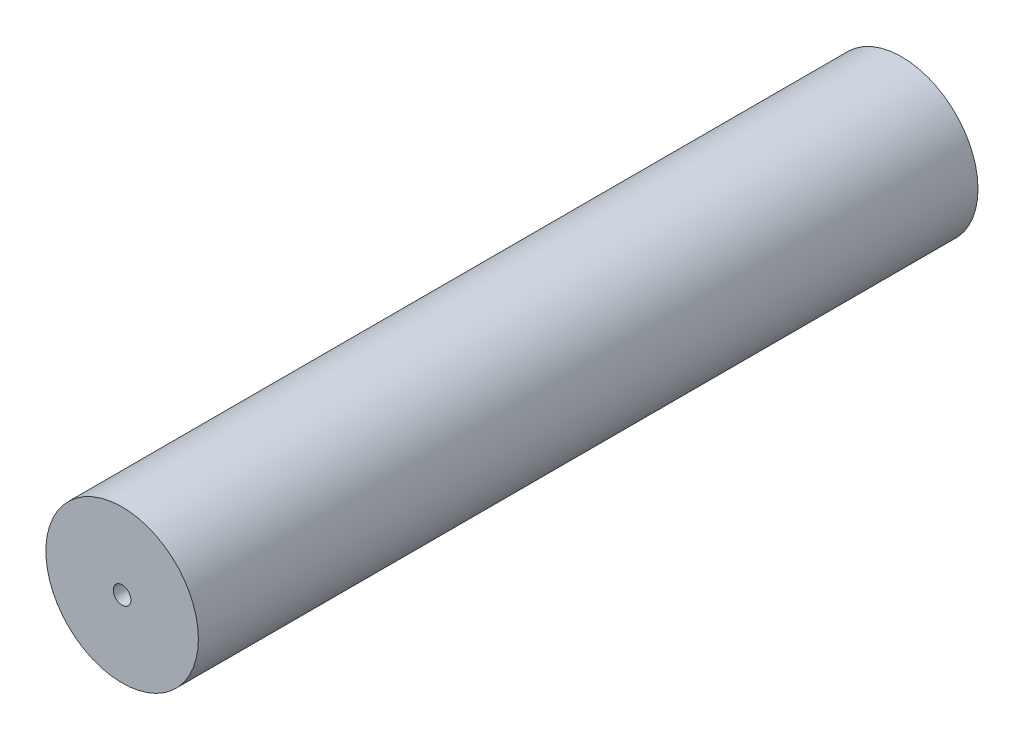
ISO-10303-21;
HEADER;
FILE_DESCRIPTION(('STEP AP214'),'2;1');
FILE_NAME('part.step','',(''),(''),'','','');
FILE_SCHEMA(('AUTOMOTIVE_DESIGN { 1 0 10303 214 1 1 1 1 }'));
ENDSEC;
DATA;
#1=APPLICATION_CONTEXT('core data for automotive mechanical design processes');
#2=APPLICATION_PROTOCOL_DEFINITION('international standard','automotive_design',2000,#1);
#3=PRODUCT_CONTEXT('',#1,'mechanical');
#4=PRODUCT('Part','Part','',(#3));
#5=PRODUCT_RELATED_PRODUCT_CATEGORY('part','',(#4));
#6=PRODUCT_DEFINITION_FORMATION('','',#4);
#7=PRODUCT_DEFINITION_CONTEXT('part definition',#1,'design');
#8=PRODUCT_DEFINITION('design','',#6,#7);
#9=PRODUCT_DEFINITION_SHAPE('','',#8);
#10=(LENGTH_UNIT() NAMED_UNIT(*) SI_UNIT(.MILLI.,.METRE.));
#11=(NAMED_UNIT(*) PLANE_ANGLE_UNIT() SI_UNIT($,.RADIAN.));
#12=(NAMED_UNIT(*) SI_UNIT($,.STERADIAN.) SOLID_ANGLE_UNIT());
#13=UNCERTAINTY_MEASURE_WITH_UNIT(LENGTH_MEASURE(1.E-05),#10,'distance_accuracy_value','');
#14=(GEOMETRIC_REPRESENTATION_CONTEXT(3) GLOBAL_UNCERTAINTY_ASSIGNED_CONTEXT((#13)) GLOBAL_UNIT_ASSIGNED_CONTEXT((#10,
#11,#12)) REPRESENTATION_CONTEXT('',''));
#15=CARTESIAN_POINT('',(0.,0.,0.));
#16=DIRECTION('',(0.,0.,1.));
#17=DIRECTION('',(1.,0.,0.));
#18=AXIS2_PLACEMENT_3D('',#15,#16,#17);
#19=CARTESIAN_POINT('',(0.,0.,292.1));
#20=DIRECTION('',(0.,0.,1.));
#21=DIRECTION('',(1.,0.,0.));
#22=AXIS2_PLACEMENT_3D('',#19,#20,#21);
#23=PLANE('',#22);
#24=CARTESIAN_POINT('',(0.,0.,292.1));
#25=DIRECTION('',(0.,0.,1.));
#26=DIRECTION('',(1.,0.,0.));
#27=AXIS2_PLACEMENT_3D('',#24,#25,#26);
#28=CIRCLE('',#27,28.575);
#29=CARTESIAN_POINT('',(28.575,0.,292.1));
#30=VERTEX_POINT('',#29);
#31=EDGE_CURVE('E10',#30,#30,#28,.T.);
#32=ORIENTED_EDGE('',*,*,#31,.T.);
#33=EDGE_LOOP('',(#32));
#34=FACE_BOUND('',#33,.T.);
#35=CARTESIAN_POINT('',(0.,0.,292.1));
#36=DIRECTION('',(0.,0.,1.));
#37=DIRECTION('',(1.,0.,0.));
#38=AXIS2_PLACEMENT_3D('',#35,#36,#37);
#39=CIRCLE('',#38,3.302);
#40=CARTESIAN_POINT('',(3.302,0.,292.1));
#41=VERTEX_POINT('',#40);
#42=EDGE_CURVE('E42',#41,#41,#39,.T.);
#43=ORIENTED_EDGE('',*,*,#42,.F.);
#44=EDGE_LOOP('',(#43));
#45=FACE_BOUND('',#44,.T.);
#46=ADVANCED_FACE('F31',(#34,#45),#23,.T.);
#47=CARTESIAN_POINT('',(0.,0.,0.));
#48=DIRECTION('',(0.,0.,1.));
#49=DIRECTION('',(1.,0.,0.));
#50=AXIS2_PLACEMENT_3D('',#47,#48,#49);
#51=PLANE('',#50);
#52=CARTESIAN_POINT('',(0.,0.,0.));
#53=DIRECTION('',(0.,0.,1.));
#54=DIRECTION('',(1.,0.,0.));
#55=AXIS2_PLACEMENT_3D('',#52,#53,#54);
#56=CIRCLE('',#55,28.575);
#57=CARTESIAN_POINT('',(28.575,0.,0.));
#58=VERTEX_POINT('',#57);
#59=EDGE_CURVE('E35',#58,#58,#56,.T.);
#60=ORIENTED_EDGE('',*,*,#59,.F.);
#61=EDGE_LOOP('',(#60));
#62=FACE_BOUND('',#61,.T.);
#63=CARTESIAN_POINT('',(0.,0.,0.));
#64=DIRECTION('',(0.,0.,1.));
#65=DIRECTION('',(1.,0.,0.));
#66=AXIS2_PLACEMENT_3D('',#63,#64,#65);
#67=CIRCLE('',#66,3.302);
#68=CARTESIAN_POINT('',(3.302,0.,0.));
#69=VERTEX_POINT('',#68);
#70=EDGE_CURVE('E44',#69,#69,#67,.T.);
#71=ORIENTED_EDGE('',*,*,#70,.T.);
#72=EDGE_LOOP('',(#71));
#73=FACE_BOUND('',#72,.T.);
#74=ADVANCED_FACE('F54',(#62,#73),#51,.F.);
#75=CARTESIAN_POINT('',(0.,0.,292.1));
#76=DIRECTION('',(0.,0.,-1.));
#77=DIRECTION('',(-1.,0.,0.));
#78=AXIS2_PLACEMENT_3D('',#75,#76,#77);
#79=CYLINDRICAL_SURFACE('',#78,28.575);
#80=ORIENTED_EDGE('',*,*,#31,.F.);
#81=EDGE_LOOP('',(#80));
#82=FACE_BOUND('',#81,.T.);
#83=ORIENTED_EDGE('',*,*,#59,.T.);
#84=EDGE_LOOP('',(#83));
#85=FACE_BOUND('',#84,.T.);
#86=ADVANCED_FACE('F33',(#82,#85),#79,.T.);
#87=CARTESIAN_POINT('',(0.,0.,292.1));
#88=DIRECTION('',(0.,0.,-1.));
#89=DIRECTION('',(-1.,0.,0.));
#90=AXIS2_PLACEMENT_3D('',#87,#88,#89);
#91=CYLINDRICAL_SURFACE('',#90,3.302);
#92=ORIENTED_EDGE('',*,*,#42,.T.);
#93=EDGE_LOOP('',(#92));
#94=FACE_BOUND('',#93,.T.);
#95=ORIENTED_EDGE('',*,*,#70,.F.);
#96=EDGE_LOOP('',(#95));
#97=FACE_BOUND('',#96,.T.);
#98=ADVANCED_FACE('F50',(#94,#97),#91,.F.);
#99=CLOSED_SHELL('',(#46,#74,#86,#98));
#100=MANIFOLD_SOLID_BREP('B2',#99);
#101=ADVANCED_BREP_SHAPE_REPRESENTATION('',(#18,#100),#14);
#102=SHAPE_DEFINITION_REPRESENTATION(#9,#101);
ENDSEC;
END-ISO-10303-21;
